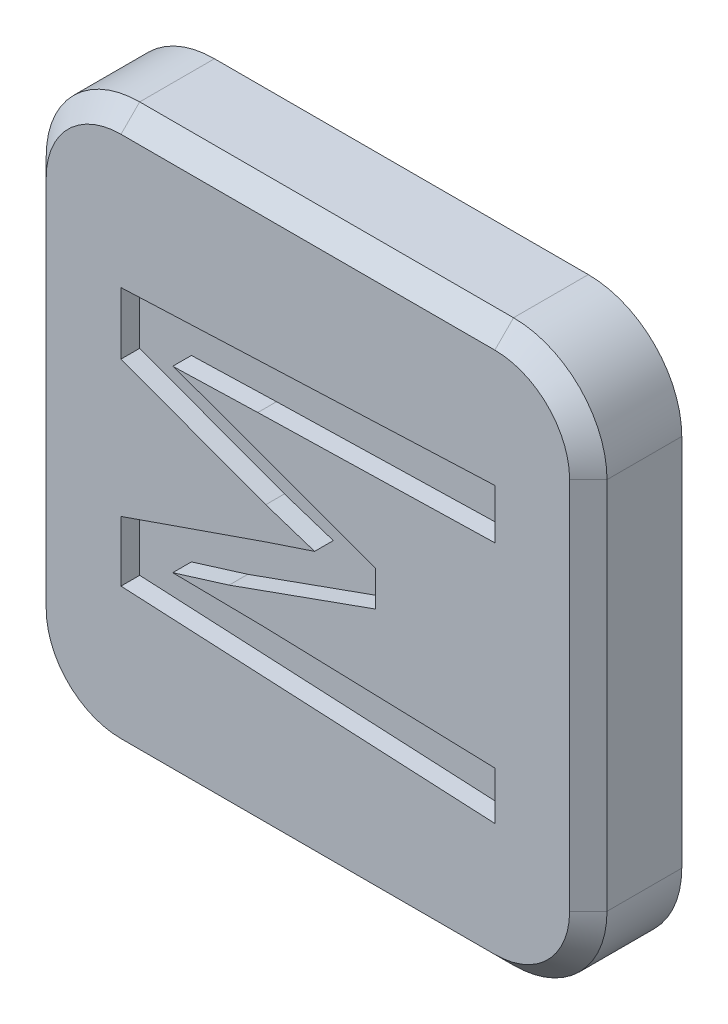
ISO-10303-21;
HEADER;
FILE_DESCRIPTION(('STEP AP214'),'2;1');
FILE_NAME('part.step','',(''),(''),'','','');
FILE_SCHEMA(('AUTOMOTIVE_DESIGN { 1 0 10303 214 1 1 1 1 }'));
ENDSEC;
DATA;
#1=APPLICATION_CONTEXT('core data for automotive mechanical design processes');
#2=APPLICATION_PROTOCOL_DEFINITION('international standard','automotive_design',2000,#1);
#3=PRODUCT_CONTEXT('',#1,'mechanical');
#4=PRODUCT('Part','Part','',(#3));
#5=PRODUCT_RELATED_PRODUCT_CATEGORY('part','',(#4));
#6=PRODUCT_DEFINITION_FORMATION('','',#4);
#7=PRODUCT_DEFINITION_CONTEXT('part definition',#1,'design');
#8=PRODUCT_DEFINITION('design','',#6,#7);
#9=PRODUCT_DEFINITION_SHAPE('','',#8);
#10=(LENGTH_UNIT() NAMED_UNIT(*) SI_UNIT(.MILLI.,.METRE.));
#11=(NAMED_UNIT(*) PLANE_ANGLE_UNIT() SI_UNIT($,.RADIAN.));
#12=(NAMED_UNIT(*) SI_UNIT($,.STERADIAN.) SOLID_ANGLE_UNIT());
#13=UNCERTAINTY_MEASURE_WITH_UNIT(LENGTH_MEASURE(1.E-05),#10,'distance_accuracy_value','');
#14=(GEOMETRIC_REPRESENTATION_CONTEXT(3) GLOBAL_UNCERTAINTY_ASSIGNED_CONTEXT((#13)) GLOBAL_UNIT_ASSIGNED_CONTEXT((#10,
#11,#12)) REPRESENTATION_CONTEXT('',''));
#15=CARTESIAN_POINT('',(0.,0.,0.));
#16=DIRECTION('',(0.,0.,1.));
#17=DIRECTION('',(1.,0.,0.));
#18=AXIS2_PLACEMENT_3D('',#15,#16,#17);
#19=CARTESIAN_POINT('',(0.,0.,0.));
#20=DIRECTION('',(0.,0.,-1.));
#21=DIRECTION('',(-1.,0.,0.));
#22=AXIS2_PLACEMENT_3D('',#19,#20,#21);
#23=PLANE('',#22);
#24=CARTESIAN_POINT('',(9.99999999999999,-10.,0.));
#25=DIRECTION('',(0.,0.,-1.));
#26=DIRECTION('',(-1.,0.,0.));
#27=AXIS2_PLACEMENT_3D('',#24,#25,#26);
#28=CIRCLE('',#27,4.);
#29=CARTESIAN_POINT('',(9.99999999999999,-14.,0.));
#30=VERTEX_POINT('',#29);
#31=CARTESIAN_POINT('',(14.,-10.,0.));
#32=VERTEX_POINT('',#31);
#33=EDGE_CURVE('E329',#30,#32,#28,.F.);
#34=ORIENTED_EDGE('',*,*,#33,.T.);
#35=DIRECTION('',(0.,1.,0.));
#36=VECTOR('',#35,1.);
#37=CARTESIAN_POINT('',(14.,0.,0.));
#38=LINE('',#37,#36);
#39=CARTESIAN_POINT('',(14.,10.,0.));
#40=VERTEX_POINT('',#39);
#41=EDGE_CURVE('E333',#32,#40,#38,.T.);
#42=ORIENTED_EDGE('',*,*,#41,.T.);
#43=CARTESIAN_POINT('',(9.99999999999999,9.99999999999999,0.));
#44=DIRECTION('',(0.,0.,-1.));
#45=DIRECTION('',(-1.,0.,0.));
#46=AXIS2_PLACEMENT_3D('',#43,#44,#45);
#47=CIRCLE('',#46,4.);
#48=CARTESIAN_POINT('',(9.99999999999999,14.,0.));
#49=VERTEX_POINT('',#48);
#50=EDGE_CURVE('E331',#40,#49,#47,.F.);
#51=ORIENTED_EDGE('',*,*,#50,.T.);
#52=DIRECTION('',(-1.,0.,0.));
#53=VECTOR('',#52,1.);
#54=CARTESIAN_POINT('',(-10.,14.,0.));
#55=LINE('',#54,#53);
#56=CARTESIAN_POINT('',(-10.,14.,0.));
#57=VERTEX_POINT('',#56);
#58=EDGE_CURVE('E327',#49,#57,#55,.T.);
#59=ORIENTED_EDGE('',*,*,#58,.T.);
#60=CARTESIAN_POINT('',(-10.,9.99999999999999,0.));
#61=DIRECTION('',(0.,0.,-1.));
#62=DIRECTION('',(-1.,0.,0.));
#63=AXIS2_PLACEMENT_3D('',#60,#61,#62);
#64=CIRCLE('',#63,4.);
#65=CARTESIAN_POINT('',(-14.,9.99999999999999,0.));
#66=VERTEX_POINT('',#65);
#67=EDGE_CURVE('E323',#57,#66,#64,.F.);
#68=ORIENTED_EDGE('',*,*,#67,.T.);
#69=DIRECTION('',(0.,-1.,0.));
#70=VECTOR('',#69,1.);
#71=CARTESIAN_POINT('',(-14.,-10.,0.));
#72=LINE('',#71,#70);
#73=CARTESIAN_POINT('',(-14.,-10.,0.));
#74=VERTEX_POINT('',#73);
#75=EDGE_CURVE('E319',#66,#74,#72,.T.);
#76=ORIENTED_EDGE('',*,*,#75,.T.);
#77=CARTESIAN_POINT('',(-10.,-10.,0.));
#78=DIRECTION('',(0.,0.,-1.));
#79=DIRECTION('',(-1.,0.,0.));
#80=AXIS2_PLACEMENT_3D('',#77,#78,#79);
#81=CIRCLE('',#80,4.);
#82=CARTESIAN_POINT('',(-10.,-14.,0.));
#83=VERTEX_POINT('',#82);
#84=EDGE_CURVE('E321',#74,#83,#81,.F.);
#85=ORIENTED_EDGE('',*,*,#84,.T.);
#86=DIRECTION('',(1.,0.,0.));
#87=VECTOR('',#86,1.);
#88=CARTESIAN_POINT('',(0.,-14.,0.));
#89=LINE('',#88,#87);
#90=EDGE_CURVE('E325',#83,#30,#89,.T.);
#91=ORIENTED_EDGE('',*,*,#90,.T.);
#92=EDGE_LOOP('',(#34,#42,#51,#59,#68,#76,#85,#91));
#93=FACE_BOUND('',#92,.T.);
#94=DIRECTION('',(-0.941433900582725,-0.337197584264176,0.));
#95=VECTOR('',#94,1.);
#96=CARTESIAN_POINT('',(0.788647956369346,-2.2018542136699,0.));
#97=LINE('',#96,#95);
#98=CARTESIAN_POINT('',(3.6231884057971,-1.18659420289855,0.));
#99=VERTEX_POINT('',#98);
#100=CARTESIAN_POINT('',(-4.21648550724638,-3.9945652173913,0.));
#101=VERTEX_POINT('',#100);
#102=EDGE_CURVE('E368',#99,#101,#97,.T.);
#103=ORIENTED_EDGE('',*,*,#102,.T.);
#104=DIRECTION('',(-0.955343755008418,-0.295496717014616,0.));
#105=VECTOR('',#104,1.);
#106=CARTESIAN_POINT('',(0.759493140997609,-2.45544869856509,0.));
#107=LINE('',#106,#105);
#108=CARTESIAN_POINT('',(-7.23278985507246,-4.92753623188406,0.));
#109=VERTEX_POINT('',#108);
#110=EDGE_CURVE('E270',#101,#109,#107,.T.);
#111=ORIENTED_EDGE('',*,*,#110,.T.);
#112=DIRECTION('',(0.99991162859465,-0.0132941717002139,0.));
#113=VECTOR('',#112,1.);
#114=CARTESIAN_POINT('',(-0.0667800108584088,-5.02281081670742,0.));
#115=LINE('',#114,#113);
#116=CARTESIAN_POINT('',(-2.46376811594203,-4.99094202898551,0.));
#117=VERTEX_POINT('',#116);
#118=EDGE_CURVE('E376',#109,#117,#115,.T.);
#119=ORIENTED_EDGE('',*,*,#118,.T.);
#120=DIRECTION('',(0.99955637932107,-0.0297832932791888,0.));
#121=VECTOR('',#120,1.);
#122=CARTESIAN_POINT('',(-0.150766219543869,-5.0598614168869,0.));
#123=LINE('',#122,#121);
#124=CARTESIAN_POINT('',(10.,-5.36231884057971,0.));
#125=VERTEX_POINT('',#124);
#126=EDGE_CURVE('E384',#117,#125,#123,.T.);
#127=ORIENTED_EDGE('',*,*,#126,.T.);
#128=DIRECTION('',(0.,-1.,0.));
#129=VECTOR('',#128,1.);
#130=CARTESIAN_POINT('',(10.,0.,0.));
#131=LINE('',#130,#129);
#132=CARTESIAN_POINT('',(10.,-7.9302536231884,0.));
#133=VERTEX_POINT('',#132);
#134=EDGE_CURVE('E387',#125,#133,#131,.T.);
#135=ORIENTED_EDGE('',*,*,#134,.T.);
#136=DIRECTION('',(-0.998761346761146,0.0497571323114702,0.));
#137=VECTOR('',#136,1.);
#138=CARTESIAN_POINT('',(-0.369340200566195,-7.41366511681962,0.));
#139=LINE('',#138,#137);
#140=CARTESIAN_POINT('',(-10.,-6.9338768115942,0.));
#141=VERTEX_POINT('',#140);
#142=EDGE_CURVE('E390',#133,#141,#139,.T.);
#143=ORIENTED_EDGE('',*,*,#142,.T.);
#144=DIRECTION('',(0.,1.,0.));
#145=VECTOR('',#144,1.);
#146=CARTESIAN_POINT('',(-10.,0.,0.));
#147=LINE('',#146,#145);
#148=CARTESIAN_POINT('',(-10.,-3.70471014492754,0.));
#149=VERTEX_POINT('',#148);
#150=EDGE_CURVE('E393',#141,#149,#147,.T.);
#151=ORIENTED_EDGE('',*,*,#150,.T.);
#152=DIRECTION('',(0.944630862759414,0.328134931274323,0.));
#153=VECTOR('',#152,1.);
#154=CARTESIAN_POINT('',(0.0716102733189457,-0.206150786827268,0.));
#155=LINE('',#154,#153);
#156=CARTESIAN_POINT('',(-2.2554347826087,-1.01449275362319,0.));
#157=VERTEX_POINT('',#156);
#158=EDGE_CURVE('E396',#149,#157,#155,.T.);
#159=ORIENTED_EDGE('',*,*,#158,.T.);
#160=DIRECTION('',(0.948847614772191,0.315734388277748,0.));
#161=VECTOR('',#160,1.);
#162=CARTESIAN_POINT('',(0.0790853731447164,-0.237668022419278,0.));
#163=LINE('',#162,#161);
#164=CARTESIAN_POINT('',(0.357789855072465,-0.144927536231881,0.));
#165=VERTEX_POINT('',#164);
#166=EDGE_CURVE('E399',#157,#165,#163,.T.);
#167=ORIENTED_EDGE('',*,*,#166,.T.);
#168=DIRECTION('',(-0.950317428247548,0.311282485162541,0.));
#169=VECTOR('',#168,1.);
#170=CARTESIAN_POINT('',(-0.0082033668673589,-0.0250441411770693,0.));
#171=LINE('',#170,#169);
#172=CARTESIAN_POINT('',(-2.2554347826087,0.711050724637683,0.));
#173=VERTEX_POINT('',#172);
#174=EDGE_CURVE('E402',#165,#173,#171,.T.);
#175=ORIENTED_EDGE('',*,*,#174,.T.);
#176=DIRECTION('',(-0.937629649104756,0.347635788030652,0.));
#177=VECTOR('',#176,1.);
#178=CARTESIAN_POINT('',(-0.0408011803979138,-0.110047347760935,0.));
#179=LINE('',#178,#177);
#180=CARTESIAN_POINT('',(-10.,3.58242753623189,0.));
#181=VERTEX_POINT('',#180);
#182=EDGE_CURVE('E405',#173,#181,#179,.T.);
#183=ORIENTED_EDGE('',*,*,#182,.T.);
#184=DIRECTION('',(0.,1.,0.));
#185=VECTOR('',#184,1.);
#186=CARTESIAN_POINT('',(-10.,0.,0.));
#187=LINE('',#186,#185);
#188=CARTESIAN_POINT('',(-10.,6.89764492753623,0.));
#189=VERTEX_POINT('',#188);
#190=EDGE_CURVE('E408',#181,#189,#187,.T.);
#191=ORIENTED_EDGE('',*,*,#190,.T.);
#192=DIRECTION('',(0.999133073092352,0.0416305447121814,0.));
#193=VECTOR('',#192,1.);
#194=CARTESIAN_POINT('',(-0.304234797679151,7.3016351442996,0.));
#195=LINE('',#194,#193);
#196=CARTESIAN_POINT('',(10.,7.73097826086957,0.));
#197=VERTEX_POINT('',#196);
#198=EDGE_CURVE('E411',#189,#197,#195,.T.);
#199=ORIENTED_EDGE('',*,*,#198,.T.);
#200=DIRECTION('',(0.,-1.,0.));
#201=VECTOR('',#200,1.);
#202=CARTESIAN_POINT('',(10.,0.,0.));
#203=LINE('',#202,#201);
#204=CARTESIAN_POINT('',(10.,5.07246376811594,0.));
#205=VERTEX_POINT('',#204);
#206=EDGE_CURVE('E414',#197,#205,#203,.T.);
#207=ORIENTED_EDGE('',*,*,#206,.T.);
#208=DIRECTION('',(-0.999713834617519,-0.0239217238997762,0.));
#209=VECTOR('',#208,1.);
#210=CARTESIAN_POINT('',(-0.115584865107026,4.83041227312945,0.));
#211=LINE('',#210,#209);
#212=CARTESIAN_POINT('',(-2.68115942028986,4.76902173913044,0.));
#213=VERTEX_POINT('',#212);
#214=EDGE_CURVE('E417',#205,#213,#211,.T.);
#215=ORIENTED_EDGE('',*,*,#214,.T.);
#216=DIRECTION('',(-0.999583933482591,-0.0288437154935275,0.));
#217=VECTOR('',#216,1.);
#218=CARTESIAN_POINT('',(-0.139729690838767,4.84235652734345,0.));
#219=LINE('',#218,#217);
#220=CARTESIAN_POINT('',(-7.23278985507247,4.63768115942029,0.));
#221=VERTEX_POINT('',#220);
#222=EDGE_CURVE('E420',#213,#221,#219,.T.);
#223=ORIENTED_EDGE('',*,*,#222,.T.);
#224=DIRECTION('',(0.944005926704509,-0.329928492777998,0.));
#225=VECTOR('',#224,1.);
#226=CARTESIAN_POINT('',(0.657116944334442,1.88017192685165,0.));
#227=LINE('',#226,#225);
#228=CARTESIAN_POINT('',(-4.52445652173913,3.6911231884058,0.));
#229=VERTEX_POINT('',#228);
#230=EDGE_CURVE('E423',#221,#229,#227,.T.);
#231=ORIENTED_EDGE('',*,*,#230,.T.);
#232=DIRECTION('',(0.938645631818358,-0.34488313653804,0.));
#233=VECTOR('',#232,1.);
#234=CARTESIAN_POINT('',(0.656742988826708,1.78741397412897,0.));
#235=LINE('',#234,#233);
#236=CARTESIAN_POINT('',(3.6231884057971,0.697463768115944,0.));
#237=VERTEX_POINT('',#236);
#238=EDGE_CURVE('E426',#229,#237,#235,.T.);
#239=ORIENTED_EDGE('',*,*,#238,.T.);
#240=DIRECTION('',(0.,-1.,0.));
#241=VECTOR('',#240,1.);
#242=CARTESIAN_POINT('',(3.6231884057971,0.,0.));
#243=LINE('',#242,#241);
#244=EDGE_CURVE('E266',#237,#99,#243,.T.);
#245=ORIENTED_EDGE('',*,*,#244,.T.);
#246=EDGE_LOOP('',(#103,#111,#119,#127,#135,#143,#151,#159,#167,#175,#183,#191,#199,#207,#215,
#223,#231,#239,#245));
#247=FACE_BOUND('',#246,.T.);
#248=ADVANCED_FACE('F42',(#93,#247),#23,.F.);
#249=CARTESIAN_POINT('',(15.,15.,-5.));
#250=DIRECTION('',(-1.,0.,0.));
#251=DIRECTION('',(0.,-1.,0.));
#252=AXIS2_PLACEMENT_3D('',#249,#250,#251);
#253=PLANE('',#252);
#254=DIRECTION('',(0.,0.,1.));
#255=VECTOR('',#254,1.);
#256=CARTESIAN_POINT('',(15.,10.,0.));
#257=LINE('',#256,#255);
#258=CARTESIAN_POINT('',(15.,10.,-5.));
#259=VERTEX_POINT('',#258);
#260=CARTESIAN_POINT('',(15.,10.,-1.));
#261=VERTEX_POINT('',#260);
#262=EDGE_CURVE('E308',#259,#261,#257,.T.);
#263=ORIENTED_EDGE('',*,*,#262,.T.);
#264=DIRECTION('',(0.,-1.,0.));
#265=VECTOR('',#264,1.);
#266=CARTESIAN_POINT('',(15.,15.,-1.));
#267=LINE('',#266,#265);
#268=CARTESIAN_POINT('',(15.,-10.,-1.));
#269=VERTEX_POINT('',#268);
#270=EDGE_CURVE('E316',#261,#269,#267,.T.);
#271=ORIENTED_EDGE('',*,*,#270,.T.);
#272=DIRECTION('',(0.,0.,1.));
#273=VECTOR('',#272,1.);
#274=CARTESIAN_POINT('',(15.,-10.,-5.));
#275=LINE('',#274,#273);
#276=CARTESIAN_POINT('',(15.,-10.,-5.));
#277=VERTEX_POINT('',#276);
#278=EDGE_CURVE('E306',#269,#277,#275,.F.);
#279=ORIENTED_EDGE('',*,*,#278,.T.);
#280=DIRECTION('',(0.,-1.,0.));
#281=VECTOR('',#280,1.);
#282=CARTESIAN_POINT('',(15.,15.,-5.));
#283=LINE('',#282,#281);
#284=EDGE_CURVE('E271',#259,#277,#283,.T.);
#285=ORIENTED_EDGE('',*,*,#284,.F.);
#286=EDGE_LOOP('',(#263,#271,#279,#285));
#287=FACE_BOUND('',#286,.T.);
#288=ADVANCED_FACE('F470',(#287),#253,.F.);
#289=CARTESIAN_POINT('',(15.,-15.,-5.));
#290=DIRECTION('',(0.,1.,0.));
#291=DIRECTION('',(0.,0.,1.));
#292=AXIS2_PLACEMENT_3D('',#289,#290,#291);
#293=PLANE('',#292);
#294=DIRECTION('',(0.,0.,1.));
#295=VECTOR('',#294,1.);
#296=CARTESIAN_POINT('',(9.99999999999999,-15.,-5.));
#297=LINE('',#296,#295);
#298=CARTESIAN_POINT('',(9.99999999999999,-15.,-5.));
#299=VERTEX_POINT('',#298);
#300=CARTESIAN_POINT('',(9.99999999999999,-15.,-1.));
#301=VERTEX_POINT('',#300);
#302=EDGE_CURVE('E313',#299,#301,#297,.T.);
#303=ORIENTED_EDGE('',*,*,#302,.T.);
#304=DIRECTION('',(-1.,0.,0.));
#305=VECTOR('',#304,1.);
#306=CARTESIAN_POINT('',(15.,-15.,-1.));
#307=LINE('',#306,#305);
#308=CARTESIAN_POINT('',(-10.,-15.,-1.));
#309=VERTEX_POINT('',#308);
#310=EDGE_CURVE('E342',#301,#309,#307,.T.);
#311=ORIENTED_EDGE('',*,*,#310,.T.);
#312=DIRECTION('',(0.,0.,1.));
#313=VECTOR('',#312,1.);
#314=CARTESIAN_POINT('',(-10.,-15.,-5.));
#315=LINE('',#314,#313);
#316=CARTESIAN_POINT('',(-10.,-15.,-5.));
#317=VERTEX_POINT('',#316);
#318=EDGE_CURVE('E311',#309,#317,#315,.F.);
#319=ORIENTED_EDGE('',*,*,#318,.T.);
#320=DIRECTION('',(-1.,0.,0.));
#321=VECTOR('',#320,1.);
#322=CARTESIAN_POINT('',(15.,-15.,-5.));
#323=LINE('',#322,#321);
#324=EDGE_CURVE('E275',#299,#317,#323,.T.);
#325=ORIENTED_EDGE('',*,*,#324,.F.);
#326=EDGE_LOOP('',(#303,#311,#319,#325));
#327=FACE_BOUND('',#326,.T.);
#328=ADVANCED_FACE('F477',(#327),#293,.F.);
#329=CARTESIAN_POINT('',(-15.,15.,-5.));
#330=DIRECTION('',(-1.,0.,0.));
#331=DIRECTION('',(0.,-1.,0.));
#332=AXIS2_PLACEMENT_3D('',#329,#330,#331);
#333=PLANE('',#332);
#334=DIRECTION('',(0.,0.,1.));
#335=VECTOR('',#334,1.);
#336=CARTESIAN_POINT('',(-15.,-10.,0.));
#337=LINE('',#336,#335);
#338=CARTESIAN_POINT('',(-15.,-10.,-5.));
#339=VERTEX_POINT('',#338);
#340=CARTESIAN_POINT('',(-15.,-10.,-1.));
#341=VERTEX_POINT('',#340);
#342=EDGE_CURVE('E294',#339,#341,#337,.T.);
#343=ORIENTED_EDGE('',*,*,#342,.T.);
#344=DIRECTION('',(0.,1.,0.));
#345=VECTOR('',#344,1.);
#346=CARTESIAN_POINT('',(-15.,9.99999999999999,-1.));
#347=LINE('',#346,#345);
#348=CARTESIAN_POINT('',(-15.,9.99999999999999,-1.));
#349=VERTEX_POINT('',#348);
#350=EDGE_CURVE('E12',#341,#349,#347,.T.);
#351=ORIENTED_EDGE('',*,*,#350,.T.);
#352=DIRECTION('',(0.,0.,1.));
#353=VECTOR('',#352,1.);
#354=CARTESIAN_POINT('',(-15.,9.99999999999999,-5.));
#355=LINE('',#354,#353);
#356=CARTESIAN_POINT('',(-15.,9.99999999999999,-5.));
#357=VERTEX_POINT('',#356);
#358=EDGE_CURVE('E296',#349,#357,#355,.F.);
#359=ORIENTED_EDGE('',*,*,#358,.T.);
#360=DIRECTION('',(0.,-1.,0.));
#361=VECTOR('',#360,1.);
#362=CARTESIAN_POINT('',(-15.,15.,-5.));
#363=LINE('',#362,#361);
#364=EDGE_CURVE('E283',#357,#339,#363,.T.);
#365=ORIENTED_EDGE('',*,*,#364,.T.);
#366=EDGE_LOOP('',(#343,#351,#359,#365));
#367=FACE_BOUND('',#366,.T.);
#368=ADVANCED_FACE('F487',(#367),#333,.T.);
#369=CARTESIAN_POINT('',(15.,15.,-5.));
#370=DIRECTION('',(0.,1.,0.));
#371=DIRECTION('',(0.,0.,1.));
#372=AXIS2_PLACEMENT_3D('',#369,#370,#371);
#373=PLANE('',#372);
#374=DIRECTION('',(0.,0.,1.));
#375=VECTOR('',#374,1.);
#376=CARTESIAN_POINT('',(-10.,15.,-5.));
#377=LINE('',#376,#375);
#378=CARTESIAN_POINT('',(-10.,15.,-5.));
#379=VERTEX_POINT('',#378);
#380=CARTESIAN_POINT('',(-10.,15.,-1.));
#381=VERTEX_POINT('',#380);
#382=EDGE_CURVE('E291',#379,#381,#377,.T.);
#383=ORIENTED_EDGE('',*,*,#382,.T.);
#384=DIRECTION('',(1.,0.,0.));
#385=VECTOR('',#384,1.);
#386=CARTESIAN_POINT('',(9.99999999999999,15.,-1.));
#387=LINE('',#386,#385);
#388=CARTESIAN_POINT('',(9.99999999999999,15.,-1.));
#389=VERTEX_POINT('',#388);
#390=EDGE_CURVE('E340',#381,#389,#387,.T.);
#391=ORIENTED_EDGE('',*,*,#390,.T.);
#392=DIRECTION('',(0.,0.,1.));
#393=VECTOR('',#392,1.);
#394=CARTESIAN_POINT('',(9.99999999999999,15.,-5.));
#395=LINE('',#394,#393);
#396=CARTESIAN_POINT('',(9.99999999999999,15.,-5.));
#397=VERTEX_POINT('',#396);
#398=EDGE_CURVE('E289',#389,#397,#395,.F.);
#399=ORIENTED_EDGE('',*,*,#398,.T.);
#400=DIRECTION('',(-1.,0.,0.));
#401=VECTOR('',#400,1.);
#402=CARTESIAN_POINT('',(15.,15.,-5.));
#403=LINE('',#402,#401);
#404=EDGE_CURVE('E286',#397,#379,#403,.T.);
#405=ORIENTED_EDGE('',*,*,#404,.T.);
#406=EDGE_LOOP('',(#383,#391,#399,#405));
#407=FACE_BOUND('',#406,.T.);
#408=ADVANCED_FACE('F484',(#407),#373,.T.);
#409=CARTESIAN_POINT('',(0.,0.,-5.));
#410=DIRECTION('',(0.,0.,-1.));
#411=DIRECTION('',(-1.,0.,0.));
#412=AXIS2_PLACEMENT_3D('',#409,#410,#411);
#413=PLANE('',#412);
#414=ORIENTED_EDGE('',*,*,#364,.F.);
#415=CARTESIAN_POINT('',(-10.,9.99999999999999,-5.));
#416=DIRECTION('',(0.,0.,-1.));
#417=DIRECTION('',(-1.,0.,0.));
#418=AXIS2_PLACEMENT_3D('',#415,#416,#417);
#419=CIRCLE('',#418,5.);
#420=EDGE_CURVE('E304',#357,#379,#419,.T.);
#421=ORIENTED_EDGE('',*,*,#420,.T.);
#422=ORIENTED_EDGE('',*,*,#404,.F.);
#423=CARTESIAN_POINT('',(9.99999999999999,9.99999999999999,-5.));
#424=DIRECTION('',(0.,0.,-1.));
#425=DIRECTION('',(-1.,0.,0.));
#426=AXIS2_PLACEMENT_3D('',#423,#424,#425);
#427=CIRCLE('',#426,5.);
#428=EDGE_CURVE('E302',#397,#259,#427,.T.);
#429=ORIENTED_EDGE('',*,*,#428,.T.);
#430=ORIENTED_EDGE('',*,*,#284,.T.);
#431=CARTESIAN_POINT('',(9.99999999999999,-10.,-5.));
#432=DIRECTION('',(0.,0.,-1.));
#433=DIRECTION('',(-1.,0.,0.));
#434=AXIS2_PLACEMENT_3D('',#431,#432,#433);
#435=CIRCLE('',#434,5.);
#436=EDGE_CURVE('E300',#277,#299,#435,.T.);
#437=ORIENTED_EDGE('',*,*,#436,.T.);
#438=ORIENTED_EDGE('',*,*,#324,.T.);
#439=CARTESIAN_POINT('',(-10.,-10.,-5.));
#440=DIRECTION('',(0.,0.,-1.));
#441=DIRECTION('',(-1.,0.,0.));
#442=AXIS2_PLACEMENT_3D('',#439,#440,#441);
#443=CIRCLE('',#442,5.);
#444=EDGE_CURVE('E298',#317,#339,#443,.T.);
#445=ORIENTED_EDGE('',*,*,#444,.T.);
#446=EDGE_LOOP('',(#414,#421,#422,#429,#430,#437,#438,#445));
#447=FACE_BOUND('',#446,.T.);
#448=ADVANCED_FACE('F482',(#447),#413,.T.);
#449=CARTESIAN_POINT('',(0.788647956369346,-2.2018542136699,-1.));
#450=DIRECTION('',(-0.337197584264176,0.941433900582725,0.));
#451=DIRECTION('',(-0.941433900582725,-0.337197584264176,0.));
#452=AXIS2_PLACEMENT_3D('',#449,#450,#451);
#453=PLANE('',#452);
#454=ORIENTED_EDGE('',*,*,#102,.F.);
#455=DIRECTION('',(0.,0.,1.));
#456=VECTOR('',#455,1.);
#457=CARTESIAN_POINT('',(3.6231884057971,-1.18659420289855,-1.));
#458=LINE('',#457,#456);
#459=CARTESIAN_POINT('',(3.6231884057971,-1.18659420289855,-1.));
#460=VERTEX_POINT('',#459);
#461=EDGE_CURVE('E265',#460,#99,#458,.T.);
#462=ORIENTED_EDGE('',*,*,#461,.F.);
#463=DIRECTION('',(-0.941433900582725,-0.337197584264176,0.));
#464=VECTOR('',#463,1.);
#465=CARTESIAN_POINT('',(0.788647956369346,-2.2018542136699,-1.));
#466=LINE('',#465,#464);
#467=CARTESIAN_POINT('',(-4.21648550724638,-3.9945652173913,-1.));
#468=VERTEX_POINT('',#467);
#469=EDGE_CURVE('E251',#460,#468,#466,.T.);
#470=ORIENTED_EDGE('',*,*,#469,.T.);
#471=DIRECTION('',(0.,0.,1.));
#472=VECTOR('',#471,1.);
#473=CARTESIAN_POINT('',(-4.21648550724638,-3.9945652173913,-1.));
#474=LINE('',#473,#472);
#475=EDGE_CURVE('E262',#468,#101,#474,.T.);
#476=ORIENTED_EDGE('',*,*,#475,.T.);
#477=EDGE_LOOP('',(#454,#462,#470,#476));
#478=FACE_BOUND('',#477,.T.);
#479=ADVANCED_FACE('F261',(#478),#453,.T.);
#480=CARTESIAN_POINT('',(0.759493140997609,-2.45544869856509,-1.));
#481=DIRECTION('',(-0.295496717014616,0.955343755008418,0.));
#482=DIRECTION('',(-0.955343755008418,-0.295496717014616,0.));
#483=AXIS2_PLACEMENT_3D('',#480,#481,#482);
#484=PLANE('',#483);
#485=ORIENTED_EDGE('',*,*,#110,.F.);
#486=ORIENTED_EDGE('',*,*,#475,.F.);
#487=DIRECTION('',(-0.955343755008418,-0.295496717014616,0.));
#488=VECTOR('',#487,1.);
#489=CARTESIAN_POINT('',(0.759493140997609,-2.45544869856509,-1.));
#490=LINE('',#489,#488);
#491=CARTESIAN_POINT('',(-7.23278985507246,-4.92753623188406,-1.));
#492=VERTEX_POINT('',#491);
#493=EDGE_CURVE('E247',#468,#492,#490,.T.);
#494=ORIENTED_EDGE('',*,*,#493,.T.);
#495=DIRECTION('',(0.,0.,1.));
#496=VECTOR('',#495,1.);
#497=CARTESIAN_POINT('',(-7.23278985507246,-4.92753623188406,-1.));
#498=LINE('',#497,#496);
#499=EDGE_CURVE('E272',#492,#109,#498,.T.);
#500=ORIENTED_EDGE('',*,*,#499,.T.);
#501=EDGE_LOOP('',(#485,#486,#494,#500));
#502=FACE_BOUND('',#501,.T.);
#503=ADVANCED_FACE('F268',(#502),#484,.T.);
#504=CARTESIAN_POINT('',(-0.0667800108584088,-5.02281081670742,-1.));
#505=DIRECTION('',(-0.0132941717002139,-0.99991162859465,0.));
#506=DIRECTION('',(0.99991162859465,-0.0132941717002139,0.));
#507=AXIS2_PLACEMENT_3D('',#504,#505,#506);
#508=PLANE('',#507);
#509=ORIENTED_EDGE('',*,*,#118,.F.);
#510=ORIENTED_EDGE('',*,*,#499,.F.);
#511=DIRECTION('',(0.99991162859465,-0.0132941717002139,0.));
#512=VECTOR('',#511,1.);
#513=CARTESIAN_POINT('',(-0.0667800108584088,-5.02281081670742,-1.));
#514=LINE('',#513,#512);
#515=CARTESIAN_POINT('',(-2.46376811594203,-4.99094202898551,-1.));
#516=VERTEX_POINT('',#515);
#517=EDGE_CURVE('E253',#492,#516,#514,.T.);
#518=ORIENTED_EDGE('',*,*,#517,.T.);
#519=DIRECTION('',(0.,0.,1.));
#520=VECTOR('',#519,1.);
#521=CARTESIAN_POINT('',(-2.46376811594203,-4.99094202898551,-1.));
#522=LINE('',#521,#520);
#523=EDGE_CURVE('E277',#516,#117,#522,.T.);
#524=ORIENTED_EDGE('',*,*,#523,.T.);
#525=EDGE_LOOP('',(#509,#510,#518,#524));
#526=FACE_BOUND('',#525,.T.);
#527=ADVANCED_FACE('F464',(#526),#508,.T.);
#528=CARTESIAN_POINT('',(-0.150766219543869,-5.0598614168869,-1.));
#529=DIRECTION('',(-0.0297832932791889,-0.99955637932107,0.));
#530=DIRECTION('',(0.99955637932107,-0.0297832932791889,0.));
#531=AXIS2_PLACEMENT_3D('',#528,#529,#530);
#532=PLANE('',#531);
#533=ORIENTED_EDGE('',*,*,#126,.F.);
#534=ORIENTED_EDGE('',*,*,#523,.F.);
#535=DIRECTION('',(0.99955637932107,-0.0297832932791888,0.));
#536=VECTOR('',#535,1.);
#537=CARTESIAN_POINT('',(-0.150766219543869,-5.0598614168869,-1.));
#538=LINE('',#537,#536);
#539=CARTESIAN_POINT('',(10.,-5.36231884057971,-1.));
#540=VERTEX_POINT('',#539);
#541=EDGE_CURVE('E917',#516,#540,#538,.T.);
#542=ORIENTED_EDGE('',*,*,#541,.T.);
#543=DIRECTION('',(0.,0.,1.));
#544=VECTOR('',#543,1.);
#545=CARTESIAN_POINT('',(10.,-5.36231884057971,-1.));
#546=LINE('',#545,#544);
#547=EDGE_CURVE('E459',#540,#125,#546,.T.);
#548=ORIENTED_EDGE('',*,*,#547,.T.);
#549=EDGE_LOOP('',(#533,#534,#542,#548));
#550=FACE_BOUND('',#549,.T.);
#551=ADVANCED_FACE('F466',(#550),#532,.T.);
#552=CARTESIAN_POINT('',(10.,0.,-1.));
#553=DIRECTION('',(-1.,0.,0.));
#554=DIRECTION('',(0.,0.,1.));
#555=AXIS2_PLACEMENT_3D('',#552,#553,#554);
#556=PLANE('',#555);
#557=ORIENTED_EDGE('',*,*,#134,.F.);
#558=ORIENTED_EDGE('',*,*,#547,.F.);
#559=DIRECTION('',(0.,-1.,0.));
#560=VECTOR('',#559,1.);
#561=CARTESIAN_POINT('',(10.,0.,-1.));
#562=LINE('',#561,#560);
#563=CARTESIAN_POINT('',(10.,-7.9302536231884,-1.));
#564=VERTEX_POINT('',#563);
#565=EDGE_CURVE('E915',#540,#564,#562,.T.);
#566=ORIENTED_EDGE('',*,*,#565,.T.);
#567=DIRECTION('',(0.,0.,1.));
#568=VECTOR('',#567,1.);
#569=CARTESIAN_POINT('',(10.,-7.9302536231884,-1.));
#570=LINE('',#569,#568);
#571=EDGE_CURVE('E457',#564,#133,#570,.T.);
#572=ORIENTED_EDGE('',*,*,#571,.T.);
#573=EDGE_LOOP('',(#557,#558,#566,#572));
#574=FACE_BOUND('',#573,.T.);
#575=ADVANCED_FACE('F604',(#574),#556,.T.);
#576=CARTESIAN_POINT('',(-0.369340200566195,-7.41366511681962,-1.));
#577=DIRECTION('',(0.0497571323114702,0.998761346761146,0.));
#578=DIRECTION('',(-0.998761346761146,0.0497571323114702,0.));
#579=AXIS2_PLACEMENT_3D('',#576,#577,#578);
#580=PLANE('',#579);
#581=ORIENTED_EDGE('',*,*,#142,.F.);
#582=ORIENTED_EDGE('',*,*,#571,.F.);
#583=DIRECTION('',(-0.998761346761146,0.0497571323114702,0.));
#584=VECTOR('',#583,1.);
#585=CARTESIAN_POINT('',(-0.369340200566195,-7.41366511681962,-1.));
#586=LINE('',#585,#584);
#587=CARTESIAN_POINT('',(-10.,-6.9338768115942,-1.));
#588=VERTEX_POINT('',#587);
#589=EDGE_CURVE('E913',#564,#588,#586,.T.);
#590=ORIENTED_EDGE('',*,*,#589,.T.);
#591=DIRECTION('',(0.,0.,1.));
#592=VECTOR('',#591,1.);
#593=CARTESIAN_POINT('',(-10.,-6.9338768115942,-1.));
#594=LINE('',#593,#592);
#595=EDGE_CURVE('E455',#588,#141,#594,.T.);
#596=ORIENTED_EDGE('',*,*,#595,.T.);
#597=EDGE_LOOP('',(#581,#582,#590,#596));
#598=FACE_BOUND('',#597,.T.);
#599=ADVANCED_FACE('F607',(#598),#580,.T.);
#600=CARTESIAN_POINT('',(-10.,0.,-1.));
#601=DIRECTION('',(1.,0.,0.));
#602=DIRECTION('',(0.,0.,-1.));
#603=AXIS2_PLACEMENT_3D('',#600,#601,#602);
#604=PLANE('',#603);
#605=ORIENTED_EDGE('',*,*,#150,.F.);
#606=ORIENTED_EDGE('',*,*,#595,.F.);
#607=DIRECTION('',(0.,1.,0.));
#608=VECTOR('',#607,1.);
#609=CARTESIAN_POINT('',(-10.,0.,-1.));
#610=LINE('',#609,#608);
#611=CARTESIAN_POINT('',(-10.,-3.70471014492754,-1.));
#612=VERTEX_POINT('',#611);
#613=EDGE_CURVE('E911',#588,#612,#610,.T.);
#614=ORIENTED_EDGE('',*,*,#613,.T.);
#615=DIRECTION('',(0.,0.,1.));
#616=VECTOR('',#615,1.);
#617=CARTESIAN_POINT('',(-10.,-3.70471014492754,-1.));
#618=LINE('',#617,#616);
#619=EDGE_CURVE('E453',#612,#149,#618,.T.);
#620=ORIENTED_EDGE('',*,*,#619,.T.);
#621=EDGE_LOOP('',(#605,#606,#614,#620));
#622=FACE_BOUND('',#621,.T.);
#623=ADVANCED_FACE('F611',(#622),#604,.T.);
#624=CARTESIAN_POINT('',(0.0716102733189457,-0.206150786827268,-1.));
#625=DIRECTION('',(0.328134931274323,-0.944630862759414,0.));
#626=DIRECTION('',(0.944630862759414,0.328134931274323,0.));
#627=AXIS2_PLACEMENT_3D('',#624,#625,#626);
#628=PLANE('',#627);
#629=ORIENTED_EDGE('',*,*,#158,.F.);
#630=ORIENTED_EDGE('',*,*,#619,.F.);
#631=DIRECTION('',(0.944630862759414,0.328134931274323,0.));
#632=VECTOR('',#631,1.);
#633=CARTESIAN_POINT('',(0.0716102733189457,-0.206150786827268,-1.));
#634=LINE('',#633,#632);
#635=CARTESIAN_POINT('',(-2.2554347826087,-1.01449275362319,-1.));
#636=VERTEX_POINT('',#635);
#637=EDGE_CURVE('E909',#612,#636,#634,.T.);
#638=ORIENTED_EDGE('',*,*,#637,.T.);
#639=DIRECTION('',(0.,0.,1.));
#640=VECTOR('',#639,1.);
#641=CARTESIAN_POINT('',(-2.2554347826087,-1.01449275362319,-1.));
#642=LINE('',#641,#640);
#643=EDGE_CURVE('E451',#636,#157,#642,.T.);
#644=ORIENTED_EDGE('',*,*,#643,.T.);
#645=EDGE_LOOP('',(#629,#630,#638,#644));
#646=FACE_BOUND('',#645,.T.);
#647=ADVANCED_FACE('F615',(#646),#628,.T.);
#648=CARTESIAN_POINT('',(0.0790853731447164,-0.237668022419278,-1.));
#649=DIRECTION('',(0.315734388277748,-0.948847614772191,0.));
#650=DIRECTION('',(0.948847614772191,0.315734388277748,0.));
#651=AXIS2_PLACEMENT_3D('',#648,#649,#650);
#652=PLANE('',#651);
#653=ORIENTED_EDGE('',*,*,#166,.F.);
#654=ORIENTED_EDGE('',*,*,#643,.F.);
#655=DIRECTION('',(0.948847614772191,0.315734388277748,0.));
#656=VECTOR('',#655,1.);
#657=CARTESIAN_POINT('',(0.0790853731447164,-0.237668022419278,-1.));
#658=LINE('',#657,#656);
#659=CARTESIAN_POINT('',(0.357789855072465,-0.144927536231881,-1.));
#660=VERTEX_POINT('',#659);
#661=EDGE_CURVE('E907',#636,#660,#658,.T.);
#662=ORIENTED_EDGE('',*,*,#661,.T.);
#663=DIRECTION('',(0.,0.,1.));
#664=VECTOR('',#663,1.);
#665=CARTESIAN_POINT('',(0.357789855072465,-0.144927536231881,-1.));
#666=LINE('',#665,#664);
#667=EDGE_CURVE('E449',#660,#165,#666,.T.);
#668=ORIENTED_EDGE('',*,*,#667,.T.);
#669=EDGE_LOOP('',(#653,#654,#662,#668));
#670=FACE_BOUND('',#669,.T.);
#671=ADVANCED_FACE('F619',(#670),#652,.T.);
#672=CARTESIAN_POINT('',(-0.0082033668673589,-0.0250441411770693,-1.));
#673=DIRECTION('',(0.311282485162541,0.950317428247548,0.));
#674=DIRECTION('',(-0.950317428247547,0.311282485162541,0.));
#675=AXIS2_PLACEMENT_3D('',#672,#673,#674);
#676=PLANE('',#675);
#677=ORIENTED_EDGE('',*,*,#174,.F.);
#678=ORIENTED_EDGE('',*,*,#667,.F.);
#679=DIRECTION('',(-0.950317428247548,0.311282485162541,0.));
#680=VECTOR('',#679,1.);
#681=CARTESIAN_POINT('',(-0.0082033668673589,-0.0250441411770693,-1.));
#682=LINE('',#681,#680);
#683=CARTESIAN_POINT('',(-2.2554347826087,0.711050724637683,-1.));
#684=VERTEX_POINT('',#683);
#685=EDGE_CURVE('E905',#660,#684,#682,.T.);
#686=ORIENTED_EDGE('',*,*,#685,.T.);
#687=DIRECTION('',(0.,0.,1.));
#688=VECTOR('',#687,1.);
#689=CARTESIAN_POINT('',(-2.2554347826087,0.711050724637683,-1.));
#690=LINE('',#689,#688);
#691=EDGE_CURVE('E447',#684,#173,#690,.T.);
#692=ORIENTED_EDGE('',*,*,#691,.T.);
#693=EDGE_LOOP('',(#677,#678,#686,#692));
#694=FACE_BOUND('',#693,.T.);
#695=ADVANCED_FACE('F623',(#694),#676,.T.);
#696=CARTESIAN_POINT('',(-0.0408011803979138,-0.110047347760935,-1.));
#697=DIRECTION('',(0.347635788030652,0.937629649104756,0.));
#698=DIRECTION('',(-0.937629649104756,0.347635788030652,0.));
#699=AXIS2_PLACEMENT_3D('',#696,#697,#698);
#700=PLANE('',#699);
#701=ORIENTED_EDGE('',*,*,#182,.F.);
#702=ORIENTED_EDGE('',*,*,#691,.F.);
#703=DIRECTION('',(-0.937629649104756,0.347635788030652,0.));
#704=VECTOR('',#703,1.);
#705=CARTESIAN_POINT('',(-0.0408011803979138,-0.110047347760935,-1.));
#706=LINE('',#705,#704);
#707=CARTESIAN_POINT('',(-10.,3.58242753623189,-1.));
#708=VERTEX_POINT('',#707);
#709=EDGE_CURVE('E903',#684,#708,#706,.T.);
#710=ORIENTED_EDGE('',*,*,#709,.T.);
#711=DIRECTION('',(0.,0.,1.));
#712=VECTOR('',#711,1.);
#713=CARTESIAN_POINT('',(-10.,3.58242753623189,-1.));
#714=LINE('',#713,#712);
#715=EDGE_CURVE('E445',#708,#181,#714,.T.);
#716=ORIENTED_EDGE('',*,*,#715,.T.);
#717=EDGE_LOOP('',(#701,#702,#710,#716));
#718=FACE_BOUND('',#717,.T.);
#719=ADVANCED_FACE('F627',(#718),#700,.T.);
#720=CARTESIAN_POINT('',(-10.,0.,-1.));
#721=DIRECTION('',(1.,0.,0.));
#722=DIRECTION('',(0.,0.,-1.));
#723=AXIS2_PLACEMENT_3D('',#720,#721,#722);
#724=PLANE('',#723);
#725=ORIENTED_EDGE('',*,*,#190,.F.);
#726=ORIENTED_EDGE('',*,*,#715,.F.);
#727=DIRECTION('',(0.,1.,0.));
#728=VECTOR('',#727,1.);
#729=CARTESIAN_POINT('',(-10.,0.,-1.));
#730=LINE('',#729,#728);
#731=CARTESIAN_POINT('',(-10.,6.89764492753623,-1.));
#732=VERTEX_POINT('',#731);
#733=EDGE_CURVE('E901',#708,#732,#730,.T.);
#734=ORIENTED_EDGE('',*,*,#733,.T.);
#735=DIRECTION('',(0.,0.,1.));
#736=VECTOR('',#735,1.);
#737=CARTESIAN_POINT('',(-10.,6.89764492753623,-1.));
#738=LINE('',#737,#736);
#739=EDGE_CURVE('E443',#732,#189,#738,.T.);
#740=ORIENTED_EDGE('',*,*,#739,.T.);
#741=EDGE_LOOP('',(#725,#726,#734,#740));
#742=FACE_BOUND('',#741,.T.);
#743=ADVANCED_FACE('F631',(#742),#724,.T.);
#744=CARTESIAN_POINT('',(-0.304234797679151,7.3016351442996,-1.));
#745=DIRECTION('',(0.0416305447121814,-0.999133073092352,0.));
#746=DIRECTION('',(0.999133073092352,0.0416305447121814,0.));
#747=AXIS2_PLACEMENT_3D('',#744,#745,#746);
#748=PLANE('',#747);
#749=ORIENTED_EDGE('',*,*,#198,.F.);
#750=ORIENTED_EDGE('',*,*,#739,.F.);
#751=DIRECTION('',(0.999133073092352,0.0416305447121814,0.));
#752=VECTOR('',#751,1.);
#753=CARTESIAN_POINT('',(-0.304234797679151,7.3016351442996,-1.));
#754=LINE('',#753,#752);
#755=CARTESIAN_POINT('',(10.,7.73097826086957,-1.));
#756=VERTEX_POINT('',#755);
#757=EDGE_CURVE('E899',#732,#756,#754,.T.);
#758=ORIENTED_EDGE('',*,*,#757,.T.);
#759=DIRECTION('',(0.,0.,1.));
#760=VECTOR('',#759,1.);
#761=CARTESIAN_POINT('',(10.,7.73097826086957,-1.));
#762=LINE('',#761,#760);
#763=EDGE_CURVE('E441',#756,#197,#762,.T.);
#764=ORIENTED_EDGE('',*,*,#763,.T.);
#765=EDGE_LOOP('',(#749,#750,#758,#764));
#766=FACE_BOUND('',#765,.T.);
#767=ADVANCED_FACE('F635',(#766),#748,.T.);
#768=CARTESIAN_POINT('',(10.,0.,-1.));
#769=DIRECTION('',(-1.,0.,0.));
#770=DIRECTION('',(0.,0.,1.));
#771=AXIS2_PLACEMENT_3D('',#768,#769,#770);
#772=PLANE('',#771);
#773=ORIENTED_EDGE('',*,*,#206,.F.);
#774=ORIENTED_EDGE('',*,*,#763,.F.);
#775=DIRECTION('',(0.,-1.,0.));
#776=VECTOR('',#775,1.);
#777=CARTESIAN_POINT('',(10.,0.,-1.));
#778=LINE('',#777,#776);
#779=CARTESIAN_POINT('',(10.,5.07246376811594,-1.));
#780=VERTEX_POINT('',#779);
#781=EDGE_CURVE('E897',#756,#780,#778,.T.);
#782=ORIENTED_EDGE('',*,*,#781,.T.);
#783=DIRECTION('',(0.,0.,1.));
#784=VECTOR('',#783,1.);
#785=CARTESIAN_POINT('',(10.,5.07246376811594,-1.));
#786=LINE('',#785,#784);
#787=EDGE_CURVE('E439',#780,#205,#786,.T.);
#788=ORIENTED_EDGE('',*,*,#787,.T.);
#789=EDGE_LOOP('',(#773,#774,#782,#788));
#790=FACE_BOUND('',#789,.T.);
#791=ADVANCED_FACE('F639',(#790),#772,.T.);
#792=CARTESIAN_POINT('',(-0.115584865107026,4.83041227312945,-1.));
#793=DIRECTION('',(-0.0239217238997762,0.999713834617518,0.));
#794=DIRECTION('',(-0.999713834617519,-0.0239217238997762,0.));
#795=AXIS2_PLACEMENT_3D('',#792,#793,#794);
#796=PLANE('',#795);
#797=ORIENTED_EDGE('',*,*,#214,.F.);
#798=ORIENTED_EDGE('',*,*,#787,.F.);
#799=DIRECTION('',(-0.999713834617519,-0.0239217238997762,0.));
#800=VECTOR('',#799,1.);
#801=CARTESIAN_POINT('',(-0.115584865107026,4.83041227312945,-1.));
#802=LINE('',#801,#800);
#803=CARTESIAN_POINT('',(-2.68115942028986,4.76902173913044,-1.));
#804=VERTEX_POINT('',#803);
#805=EDGE_CURVE('E895',#780,#804,#802,.T.);
#806=ORIENTED_EDGE('',*,*,#805,.T.);
#807=DIRECTION('',(0.,0.,1.));
#808=VECTOR('',#807,1.);
#809=CARTESIAN_POINT('',(-2.68115942028986,4.76902173913044,-1.));
#810=LINE('',#809,#808);
#811=EDGE_CURVE('E437',#804,#213,#810,.T.);
#812=ORIENTED_EDGE('',*,*,#811,.T.);
#813=EDGE_LOOP('',(#797,#798,#806,#812));
#814=FACE_BOUND('',#813,.T.);
#815=ADVANCED_FACE('F643',(#814),#796,.T.);
#816=CARTESIAN_POINT('',(-0.139729690838767,4.84235652734345,-1.));
#817=DIRECTION('',(-0.0288437154935275,0.999583933482591,0.));
#818=DIRECTION('',(-0.999583933482591,-0.0288437154935275,0.));
#819=AXIS2_PLACEMENT_3D('',#816,#817,#818);
#820=PLANE('',#819);
#821=ORIENTED_EDGE('',*,*,#222,.F.);
#822=ORIENTED_EDGE('',*,*,#811,.F.);
#823=DIRECTION('',(-0.999583933482591,-0.0288437154935275,0.));
#824=VECTOR('',#823,1.);
#825=CARTESIAN_POINT('',(-0.139729690838767,4.84235652734345,-1.));
#826=LINE('',#825,#824);
#827=CARTESIAN_POINT('',(-7.23278985507247,4.63768115942029,-1.));
#828=VERTEX_POINT('',#827);
#829=EDGE_CURVE('E891',#804,#828,#826,.T.);
#830=ORIENTED_EDGE('',*,*,#829,.T.);
#831=DIRECTION('',(0.,0.,1.));
#832=VECTOR('',#831,1.);
#833=CARTESIAN_POINT('',(-7.23278985507247,4.63768115942029,-1.));
#834=LINE('',#833,#832);
#835=EDGE_CURVE('E435',#828,#221,#834,.T.);
#836=ORIENTED_EDGE('',*,*,#835,.T.);
#837=EDGE_LOOP('',(#821,#822,#830,#836));
#838=FACE_BOUND('',#837,.T.);
#839=ADVANCED_FACE('F647',(#838),#820,.T.);
#840=CARTESIAN_POINT('',(0.657116944334442,1.88017192685165,-1.));
#841=DIRECTION('',(-0.329928492777998,-0.944005926704509,0.));
#842=DIRECTION('',(0.944005926704509,-0.329928492777998,0.));
#843=AXIS2_PLACEMENT_3D('',#840,#841,#842);
#844=PLANE('',#843);
#845=ORIENTED_EDGE('',*,*,#230,.F.);
#846=ORIENTED_EDGE('',*,*,#835,.F.);
#847=DIRECTION('',(0.944005926704509,-0.329928492777998,0.));
#848=VECTOR('',#847,1.);
#849=CARTESIAN_POINT('',(0.657116944334442,1.88017192685165,-1.));
#850=LINE('',#849,#848);
#851=CARTESIAN_POINT('',(-4.52445652173913,3.6911231884058,-1.));
#852=VERTEX_POINT('',#851);
#853=EDGE_CURVE('E890',#828,#852,#850,.T.);
#854=ORIENTED_EDGE('',*,*,#853,.T.);
#855=DIRECTION('',(0.,0.,1.));
#856=VECTOR('',#855,1.);
#857=CARTESIAN_POINT('',(-4.52445652173913,3.6911231884058,-1.));
#858=LINE('',#857,#856);
#859=EDGE_CURVE('E433',#852,#229,#858,.T.);
#860=ORIENTED_EDGE('',*,*,#859,.T.);
#861=EDGE_LOOP('',(#845,#846,#854,#860));
#862=FACE_BOUND('',#861,.T.);
#863=ADVANCED_FACE('F651',(#862),#844,.T.);
#864=CARTESIAN_POINT('',(0.656742988826708,1.78741397412897,-1.));
#865=DIRECTION('',(-0.34488313653804,-0.938645631818358,0.));
#866=DIRECTION('',(0.938645631818358,-0.34488313653804,0.));
#867=AXIS2_PLACEMENT_3D('',#864,#865,#866);
#868=PLANE('',#867);
#869=ORIENTED_EDGE('',*,*,#238,.F.);
#870=ORIENTED_EDGE('',*,*,#859,.F.);
#871=DIRECTION('',(0.938645631818358,-0.34488313653804,0.));
#872=VECTOR('',#871,1.);
#873=CARTESIAN_POINT('',(0.656742988826708,1.78741397412897,-1.));
#874=LINE('',#873,#872);
#875=CARTESIAN_POINT('',(3.6231884057971,0.697463768115944,-1.));
#876=VERTEX_POINT('',#875);
#877=EDGE_CURVE('E888',#852,#876,#874,.T.);
#878=ORIENTED_EDGE('',*,*,#877,.T.);
#879=DIRECTION('',(0.,0.,1.));
#880=VECTOR('',#879,1.);
#881=CARTESIAN_POINT('',(3.6231884057971,0.697463768115944,-1.));
#882=LINE('',#881,#880);
#883=EDGE_CURVE('E431',#876,#237,#882,.T.);
#884=ORIENTED_EDGE('',*,*,#883,.T.);
#885=EDGE_LOOP('',(#869,#870,#878,#884));
#886=FACE_BOUND('',#885,.T.);
#887=ADVANCED_FACE('F655',(#886),#868,.T.);
#888=CARTESIAN_POINT('',(3.6231884057971,0.,-1.));
#889=DIRECTION('',(-1.,0.,0.));
#890=DIRECTION('',(0.,0.,1.));
#891=AXIS2_PLACEMENT_3D('',#888,#889,#890);
#892=PLANE('',#891);
#893=ORIENTED_EDGE('',*,*,#244,.F.);
#894=ORIENTED_EDGE('',*,*,#883,.F.);
#895=DIRECTION('',(0.,-1.,0.));
#896=VECTOR('',#895,1.);
#897=CARTESIAN_POINT('',(3.6231884057971,0.,-1.));
#898=LINE('',#897,#896);
#899=EDGE_CURVE('E379',#876,#460,#898,.T.);
#900=ORIENTED_EDGE('',*,*,#899,.T.);
#901=ORIENTED_EDGE('',*,*,#461,.T.);
#902=EDGE_LOOP('',(#893,#894,#900,#901));
#903=FACE_BOUND('',#902,.T.);
#904=ADVANCED_FACE('F659',(#903),#892,.T.);
#905=CARTESIAN_POINT('',(0.,0.,-1.));
#906=DIRECTION('',(0.,0.,1.));
#907=DIRECTION('',(1.,0.,0.));
#908=AXIS2_PLACEMENT_3D('',#905,#906,#907);
#909=PLANE('',#908);
#910=ORIENTED_EDGE('',*,*,#469,.F.);
#911=ORIENTED_EDGE('',*,*,#899,.F.);
#912=ORIENTED_EDGE('',*,*,#877,.F.);
#913=ORIENTED_EDGE('',*,*,#853,.F.);
#914=ORIENTED_EDGE('',*,*,#829,.F.);
#915=ORIENTED_EDGE('',*,*,#805,.F.);
#916=ORIENTED_EDGE('',*,*,#781,.F.);
#917=ORIENTED_EDGE('',*,*,#757,.F.);
#918=ORIENTED_EDGE('',*,*,#733,.F.);
#919=ORIENTED_EDGE('',*,*,#709,.F.);
#920=ORIENTED_EDGE('',*,*,#685,.F.);
#921=ORIENTED_EDGE('',*,*,#661,.F.);
#922=ORIENTED_EDGE('',*,*,#637,.F.);
#923=ORIENTED_EDGE('',*,*,#613,.F.);
#924=ORIENTED_EDGE('',*,*,#589,.F.);
#925=ORIENTED_EDGE('',*,*,#565,.F.);
#926=ORIENTED_EDGE('',*,*,#541,.F.);
#927=ORIENTED_EDGE('',*,*,#517,.F.);
#928=ORIENTED_EDGE('',*,*,#493,.F.);
#929=EDGE_LOOP('',(#910,#911,#912,#913,#914,#915,#916,#917,#918,#919,#920,#921,#922,#923,#924,
#925,#926,#927,#928));
#930=FACE_BOUND('',#929,.T.);
#931=ADVANCED_FACE('F249',(#930),#909,.T.);
#932=CARTESIAN_POINT('',(-10.,9.99999999999999,-5.));
#933=DIRECTION('',(0.,0.,1.));
#934=DIRECTION('',(1.,0.,0.));
#935=AXIS2_PLACEMENT_3D('',#932,#933,#934);
#936=CYLINDRICAL_SURFACE('',#935,5.);
#937=ORIENTED_EDGE('',*,*,#358,.F.);
#938=CARTESIAN_POINT('',(-10.,9.99999999999999,-1.));
#939=DIRECTION('',(0.,0.,-1.));
#940=DIRECTION('',(-1.,0.,0.));
#941=AXIS2_PLACEMENT_3D('',#938,#939,#940);
#942=CIRCLE('',#941,5.);
#943=EDGE_CURVE('E344',#349,#381,#942,.T.);
#944=ORIENTED_EDGE('',*,*,#943,.T.);
#945=ORIENTED_EDGE('',*,*,#382,.F.);
#946=ORIENTED_EDGE('',*,*,#420,.F.);
#947=EDGE_LOOP('',(#937,#944,#945,#946));
#948=FACE_BOUND('',#947,.T.);
#949=ADVANCED_FACE('F494',(#948),#936,.T.);
#950=CARTESIAN_POINT('',(9.99999999999999,9.99999999999999,-5.));
#951=DIRECTION('',(0.,0.,-1.));
#952=DIRECTION('',(-1.,0.,0.));
#953=AXIS2_PLACEMENT_3D('',#950,#951,#952);
#954=CYLINDRICAL_SURFACE('',#953,5.);
#955=ORIENTED_EDGE('',*,*,#398,.F.);
#956=CARTESIAN_POINT('',(9.99999999999999,9.99999999999999,-1.));
#957=DIRECTION('',(0.,0.,-1.));
#958=DIRECTION('',(-1.,0.,0.));
#959=AXIS2_PLACEMENT_3D('',#956,#957,#958);
#960=CIRCLE('',#959,5.);
#961=EDGE_CURVE('E336',#389,#261,#960,.T.);
#962=ORIENTED_EDGE('',*,*,#961,.T.);
#963=ORIENTED_EDGE('',*,*,#262,.F.);
#964=ORIENTED_EDGE('',*,*,#428,.F.);
#965=EDGE_LOOP('',(#955,#962,#963,#964));
#966=FACE_BOUND('',#965,.T.);
#967=ADVANCED_FACE('F497',(#966),#954,.T.);
#968=CARTESIAN_POINT('',(9.99999999999999,-10.,-5.));
#969=DIRECTION('',(0.,0.,1.));
#970=DIRECTION('',(1.,0.,0.));
#971=AXIS2_PLACEMENT_3D('',#968,#969,#970);
#972=CYLINDRICAL_SURFACE('',#971,5.);
#973=ORIENTED_EDGE('',*,*,#278,.F.);
#974=CARTESIAN_POINT('',(9.99999999999999,-10.,-1.));
#975=DIRECTION('',(0.,0.,-1.));
#976=DIRECTION('',(-1.,0.,0.));
#977=AXIS2_PLACEMENT_3D('',#974,#975,#976);
#978=CIRCLE('',#977,5.);
#979=EDGE_CURVE('E338',#269,#301,#978,.T.);
#980=ORIENTED_EDGE('',*,*,#979,.T.);
#981=ORIENTED_EDGE('',*,*,#302,.F.);
#982=ORIENTED_EDGE('',*,*,#436,.F.);
#983=EDGE_LOOP('',(#973,#980,#981,#982));
#984=FACE_BOUND('',#983,.T.);
#985=ADVANCED_FACE('F501',(#984),#972,.T.);
#986=CARTESIAN_POINT('',(-10.,-10.,-5.));
#987=DIRECTION('',(0.,0.,-1.));
#988=DIRECTION('',(-1.,0.,0.));
#989=AXIS2_PLACEMENT_3D('',#986,#987,#988);
#990=CYLINDRICAL_SURFACE('',#989,5.);
#991=ORIENTED_EDGE('',*,*,#318,.F.);
#992=CARTESIAN_POINT('',(-10.,-10.,-1.));
#993=DIRECTION('',(0.,0.,-1.));
#994=DIRECTION('',(-1.,0.,0.));
#995=AXIS2_PLACEMENT_3D('',#992,#993,#994);
#996=CIRCLE('',#995,5.);
#997=EDGE_CURVE('E52',#309,#341,#996,.T.);
#998=ORIENTED_EDGE('',*,*,#997,.T.);
#999=ORIENTED_EDGE('',*,*,#342,.F.);
#1000=ORIENTED_EDGE('',*,*,#444,.F.);
#1001=EDGE_LOOP('',(#991,#998,#999,#1000));
#1002=FACE_BOUND('',#1001,.T.);
#1003=ADVANCED_FACE('F505',(#1002),#990,.T.);
#1004=CARTESIAN_POINT('',(-14.,0.,0.));
#1005=DIRECTION('',(-0.707106781186549,0.,0.707106781186546));
#1006=DIRECTION('',(0.,1.,0.));
#1007=AXIS2_PLACEMENT_3D('',#1004,#1005,#1006);
#1008=PLANE('',#1007);
#1009=DIRECTION('',(-0.707106781186546,0.,-0.707106781186549));
#1010=VECTOR('',#1009,1.);
#1011=CARTESIAN_POINT('',(-14.,-10.,0.));
#1012=LINE('',#1011,#1010);
#1013=EDGE_CURVE('E362',#74,#341,#1012,.T.);
#1014=ORIENTED_EDGE('',*,*,#1013,.F.);
#1015=ORIENTED_EDGE('',*,*,#75,.F.);
#1016=DIRECTION('',(0.707106781186547,0.,0.707106781186548));
#1017=VECTOR('',#1016,1.);
#1018=CARTESIAN_POINT('',(-15.,9.99999999999999,-1.));
#1019=LINE('',#1018,#1017);
#1020=EDGE_CURVE('E47',#349,#66,#1019,.T.);
#1021=ORIENTED_EDGE('',*,*,#1020,.F.);
#1022=ORIENTED_EDGE('',*,*,#350,.F.);
#1023=EDGE_LOOP('',(#1014,#1015,#1021,#1022));
#1024=FACE_BOUND('',#1023,.T.);
#1025=ADVANCED_FACE('F45',(#1024),#1008,.T.);
#1026=CARTESIAN_POINT('',(-10.,9.99999999999999,0.));
#1027=DIRECTION('',(0.,0.,-1.));
#1028=DIRECTION('',(-1.,0.,0.));
#1029=AXIS2_PLACEMENT_3D('',#1026,#1027,#1028);
#1030=CONICAL_SURFACE('',#1029,4.,0.785398163397447);
#1031=ORIENTED_EDGE('',*,*,#1020,.T.);
#1032=ORIENTED_EDGE('',*,*,#67,.F.);
#1033=DIRECTION('',(0.,-0.707106781186547,0.707106781186548));
#1034=VECTOR('',#1033,1.);
#1035=CARTESIAN_POINT('',(-10.,15.,-1.));
#1036=LINE('',#1035,#1034);
#1037=EDGE_CURVE('E360',#381,#57,#1036,.T.);
#1038=ORIENTED_EDGE('',*,*,#1037,.F.);
#1039=ORIENTED_EDGE('',*,*,#943,.F.);
#1040=EDGE_LOOP('',(#1031,#1032,#1038,#1039));
#1041=FACE_BOUND('',#1040,.T.);
#1042=ADVANCED_FACE('F550',(#1041),#1030,.T.);
#1043=CARTESIAN_POINT('',(-10.,-10.,0.));
#1044=DIRECTION('',(0.,0.,-1.));
#1045=DIRECTION('',(-1.,0.,0.));
#1046=AXIS2_PLACEMENT_3D('',#1043,#1044,#1045);
#1047=CONICAL_SURFACE('',#1046,4.,0.785398163397447);
#1048=ORIENTED_EDGE('',*,*,#1013,.T.);
#1049=ORIENTED_EDGE('',*,*,#997,.F.);
#1050=DIRECTION('',(0.,-0.707106781186546,-0.707106781186549));
#1051=VECTOR('',#1050,1.);
#1052=CARTESIAN_POINT('',(-10.,-14.,0.));
#1053=LINE('',#1052,#1051);
#1054=EDGE_CURVE('E357',#83,#309,#1053,.T.);
#1055=ORIENTED_EDGE('',*,*,#1054,.F.);
#1056=ORIENTED_EDGE('',*,*,#84,.F.);
#1057=EDGE_LOOP('',(#1048,#1049,#1055,#1056));
#1058=FACE_BOUND('',#1057,.T.);
#1059=ADVANCED_FACE('F544',(#1058),#1047,.T.);
#1060=CARTESIAN_POINT('',(0.,14.,0.));
#1061=DIRECTION('',(0.,0.707106781186549,0.707106781186546));
#1062=DIRECTION('',(1.,0.,0.));
#1063=AXIS2_PLACEMENT_3D('',#1060,#1061,#1062);
#1064=PLANE('',#1063);
#1065=ORIENTED_EDGE('',*,*,#1037,.T.);
#1066=ORIENTED_EDGE('',*,*,#58,.F.);
#1067=DIRECTION('',(0.,-0.707106781186546,0.707106781186549));
#1068=VECTOR('',#1067,1.);
#1069=CARTESIAN_POINT('',(9.99999999999999,15.,-1.));
#1070=LINE('',#1069,#1068);
#1071=EDGE_CURVE('E354',#389,#49,#1070,.T.);
#1072=ORIENTED_EDGE('',*,*,#1071,.F.);
#1073=ORIENTED_EDGE('',*,*,#390,.F.);
#1074=EDGE_LOOP('',(#1065,#1066,#1072,#1073));
#1075=FACE_BOUND('',#1074,.T.);
#1076=ADVANCED_FACE('F537',(#1075),#1064,.T.);
#1077=CARTESIAN_POINT('',(15.,-15.,-1.));
#1078=DIRECTION('',(0.,0.707106781186549,-0.707106781186546));
#1079=DIRECTION('',(-1.,0.,0.));
#1080=AXIS2_PLACEMENT_3D('',#1077,#1078,#1079);
#1081=PLANE('',#1080);
#1082=ORIENTED_EDGE('',*,*,#1054,.T.);
#1083=ORIENTED_EDGE('',*,*,#310,.F.);
#1084=DIRECTION('',(0.,-0.707106781186546,-0.707106781186549));
#1085=VECTOR('',#1084,1.);
#1086=CARTESIAN_POINT('',(9.99999999999999,-14.,0.));
#1087=LINE('',#1086,#1085);
#1088=EDGE_CURVE('E351',#30,#301,#1087,.T.);
#1089=ORIENTED_EDGE('',*,*,#1088,.F.);
#1090=ORIENTED_EDGE('',*,*,#90,.F.);
#1091=EDGE_LOOP('',(#1082,#1083,#1089,#1090));
#1092=FACE_BOUND('',#1091,.T.);
#1093=ADVANCED_FACE('F530',(#1092),#1081,.F.);
#1094=CARTESIAN_POINT('',(9.99999999999999,9.99999999999999,0.));
#1095=DIRECTION('',(0.,0.,-1.));
#1096=DIRECTION('',(-1.,0.,0.));
#1097=AXIS2_PLACEMENT_3D('',#1094,#1095,#1096);
#1098=CONICAL_SURFACE('',#1097,4.,0.785398163397447);
#1099=ORIENTED_EDGE('',*,*,#1071,.T.);
#1100=ORIENTED_EDGE('',*,*,#50,.F.);
#1101=DIRECTION('',(-0.707106781186546,0.,0.707106781186549));
#1102=VECTOR('',#1101,1.);
#1103=CARTESIAN_POINT('',(15.,10.,-1.));
#1104=LINE('',#1103,#1102);
#1105=EDGE_CURVE('E349',#261,#40,#1104,.T.);
#1106=ORIENTED_EDGE('',*,*,#1105,.F.);
#1107=ORIENTED_EDGE('',*,*,#961,.F.);
#1108=EDGE_LOOP('',(#1099,#1100,#1106,#1107));
#1109=FACE_BOUND('',#1108,.T.);
#1110=ADVANCED_FACE('F523',(#1109),#1098,.T.);
#1111=CARTESIAN_POINT('',(9.99999999999999,-10.,0.));
#1112=DIRECTION('',(0.,0.,-1.));
#1113=DIRECTION('',(-1.,0.,0.));
#1114=AXIS2_PLACEMENT_3D('',#1111,#1112,#1113);
#1115=CONICAL_SURFACE('',#1114,4.,0.785398163397447);
#1116=ORIENTED_EDGE('',*,*,#1088,.T.);
#1117=ORIENTED_EDGE('',*,*,#979,.F.);
#1118=DIRECTION('',(0.707106781186547,0.,-0.707106781186548));
#1119=VECTOR('',#1118,1.);
#1120=CARTESIAN_POINT('',(14.,-10.,0.));
#1121=LINE('',#1120,#1119);
#1122=EDGE_CURVE('E347',#32,#269,#1121,.T.);
#1123=ORIENTED_EDGE('',*,*,#1122,.F.);
#1124=ORIENTED_EDGE('',*,*,#33,.F.);
#1125=EDGE_LOOP('',(#1116,#1117,#1123,#1124));
#1126=FACE_BOUND('',#1125,.T.);
#1127=ADVANCED_FACE('F516',(#1126),#1115,.T.);
#1128=CARTESIAN_POINT('',(15.,15.,-1.));
#1129=DIRECTION('',(-0.707106781186548,0.,-0.707106781186547));
#1130=DIRECTION('',(0.,-1.,0.));
#1131=AXIS2_PLACEMENT_3D('',#1128,#1129,#1130);
#1132=PLANE('',#1131);
#1133=ORIENTED_EDGE('',*,*,#1105,.T.);
#1134=ORIENTED_EDGE('',*,*,#41,.F.);
#1135=ORIENTED_EDGE('',*,*,#1122,.T.);
#1136=ORIENTED_EDGE('',*,*,#270,.F.);
#1137=EDGE_LOOP('',(#1133,#1134,#1135,#1136));
#1138=FACE_BOUND('',#1137,.T.);
#1139=ADVANCED_FACE('F510',(#1138),#1132,.F.);
#1140=CLOSED_SHELL('',(#248,#288,#328,#368,#408,#448,#479,#503,#527,#551,#575,#599,#623,#647,
#671,#695,#719,#743,#767,#791,#815,#839,#863,#887,#904,#931,#949,#967,#985,#1003,#1025,#1042,
#1059,#1076,#1093,#1110,#1127,#1139));
#1141=MANIFOLD_SOLID_BREP('B2',#1140);
#1142=ADVANCED_BREP_SHAPE_REPRESENTATION('',(#18,#1141),#14);
#1143=SHAPE_DEFINITION_REPRESENTATION(#9,#1142);
ENDSEC;
END-ISO-10303-21;
